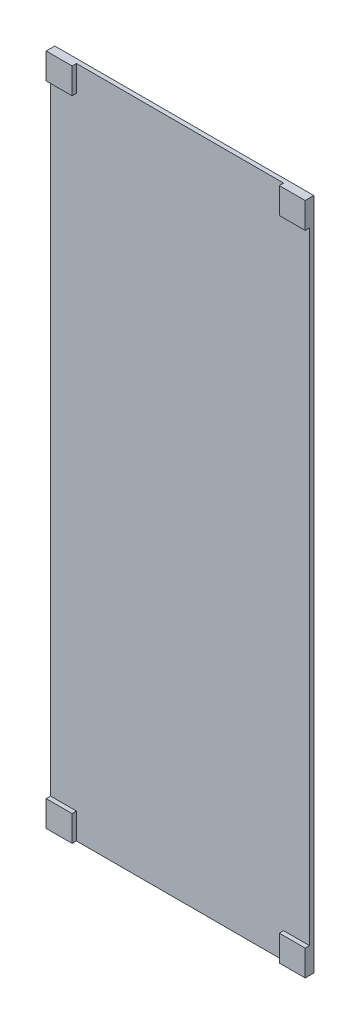
ISO-10303-21;
HEADER;
FILE_DESCRIPTION(('STEP AP214'),'2;1');
FILE_NAME('part.step','',(''),(''),'','','');
FILE_SCHEMA(('AUTOMOTIVE_DESIGN { 1 0 10303 214 1 1 1 1 }'));
ENDSEC;
DATA;
#1=APPLICATION_CONTEXT('core data for automotive mechanical design processes');
#2=APPLICATION_PROTOCOL_DEFINITION('international standard','automotive_design',2000,#1);
#3=PRODUCT_CONTEXT('',#1,'mechanical');
#4=PRODUCT('Part','Part','',(#3));
#5=PRODUCT_RELATED_PRODUCT_CATEGORY('part','',(#4));
#6=PRODUCT_DEFINITION_FORMATION('','',#4);
#7=PRODUCT_DEFINITION_CONTEXT('part definition',#1,'design');
#8=PRODUCT_DEFINITION('design','',#6,#7);
#9=PRODUCT_DEFINITION_SHAPE('','',#8);
#10=(LENGTH_UNIT() NAMED_UNIT(*) SI_UNIT(.MILLI.,.METRE.));
#11=(NAMED_UNIT(*) PLANE_ANGLE_UNIT() SI_UNIT($,.RADIAN.));
#12=(NAMED_UNIT(*) SI_UNIT($,.STERADIAN.) SOLID_ANGLE_UNIT());
#13=UNCERTAINTY_MEASURE_WITH_UNIT(LENGTH_MEASURE(1.E-05),#10,'distance_accuracy_value','');
#14=(GEOMETRIC_REPRESENTATION_CONTEXT(3) GLOBAL_UNCERTAINTY_ASSIGNED_CONTEXT((#13)) GLOBAL_UNIT_ASSIGNED_CONTEXT((#10,
#11,#12)) REPRESENTATION_CONTEXT('',''));
#15=CARTESIAN_POINT('',(0.,0.,0.));
#16=DIRECTION('',(0.,0.,1.));
#17=DIRECTION('',(1.,0.,0.));
#18=AXIS2_PLACEMENT_3D('',#15,#16,#17);
#19=CARTESIAN_POINT('',(0.,0.,25.4));
#20=DIRECTION('',(0.,0.,-1.));
#21=DIRECTION('',(-1.,0.,0.));
#22=AXIS2_PLACEMENT_3D('',#19,#20,#21);
#23=PLANE('',#22);
#24=DIRECTION('',(0.,1.,0.));
#25=VECTOR('',#24,1.);
#26=CARTESIAN_POINT('',(152.4,0.,25.4));
#27=LINE('',#26,#25);
#28=CARTESIAN_POINT('',(152.4,0.,25.4));
#29=VERTEX_POINT('',#28);
#30=CARTESIAN_POINT('',(152.4,152.4,25.4));
#31=VERTEX_POINT('',#30);
#32=EDGE_CURVE('E177',#29,#31,#27,.T.);
#33=ORIENTED_EDGE('',*,*,#32,.F.);
#34=DIRECTION('',(1.,0.,0.));
#35=VECTOR('',#34,1.);
#36=CARTESIAN_POINT('',(0.,0.,25.4));
#37=LINE('',#36,#35);
#38=CARTESIAN_POINT('',(1371.6,0.,25.4));
#39=VERTEX_POINT('',#38);
#40=EDGE_CURVE('E298',#29,#39,#37,.T.);
#41=ORIENTED_EDGE('',*,*,#40,.T.);
#42=DIRECTION('',(0.,-1.,0.));
#43=VECTOR('',#42,1.);
#44=CARTESIAN_POINT('',(1371.6,0.,25.4));
#45=LINE('',#44,#43);
#46=CARTESIAN_POINT('',(1371.6,152.4,25.4));
#47=VERTEX_POINT('',#46);
#48=EDGE_CURVE('E201',#47,#39,#45,.T.);
#49=ORIENTED_EDGE('',*,*,#48,.F.);
#50=DIRECTION('',(-1.,0.,0.));
#51=VECTOR('',#50,1.);
#52=CARTESIAN_POINT('',(1524.,152.4,25.4));
#53=LINE('',#52,#51);
#54=CARTESIAN_POINT('',(1524.,152.4,25.4));
#55=VERTEX_POINT('',#54);
#56=EDGE_CURVE('E195',#55,#47,#53,.T.);
#57=ORIENTED_EDGE('',*,*,#56,.F.);
#58=DIRECTION('',(0.,1.,0.));
#59=VECTOR('',#58,1.);
#60=CARTESIAN_POINT('',(1524.,0.,25.4));
#61=LINE('',#60,#59);
#62=CARTESIAN_POINT('',(1524.,3810.,25.4));
#63=VERTEX_POINT('',#62);
#64=EDGE_CURVE('E302',#55,#63,#61,.T.);
#65=ORIENTED_EDGE('',*,*,#64,.T.);
#66=DIRECTION('',(1.,0.,0.));
#67=VECTOR('',#66,1.);
#68=CARTESIAN_POINT('',(1524.,3810.,25.4));
#69=LINE('',#68,#67);
#70=CARTESIAN_POINT('',(1371.6,3810.,25.4));
#71=VERTEX_POINT('',#70);
#72=EDGE_CURVE('E235',#71,#63,#69,.T.);
#73=ORIENTED_EDGE('',*,*,#72,.F.);
#74=DIRECTION('',(0.,-1.,0.));
#75=VECTOR('',#74,1.);
#76=CARTESIAN_POINT('',(1371.6,3962.4,25.4));
#77=LINE('',#76,#75);
#78=CARTESIAN_POINT('',(1371.6,3962.4,25.4));
#79=VERTEX_POINT('',#78);
#80=EDGE_CURVE('E229',#79,#71,#77,.T.);
#81=ORIENTED_EDGE('',*,*,#80,.F.);
#82=DIRECTION('',(-1.,0.,0.));
#83=VECTOR('',#82,1.);
#84=CARTESIAN_POINT('',(0.,3962.4,25.4));
#85=LINE('',#84,#83);
#86=CARTESIAN_POINT('',(152.4,3962.4,25.4));
#87=VERTEX_POINT('',#86);
#88=EDGE_CURVE('E305',#79,#87,#85,.T.);
#89=ORIENTED_EDGE('',*,*,#88,.T.);
#90=DIRECTION('',(0.,1.,0.));
#91=VECTOR('',#90,1.);
#92=CARTESIAN_POINT('',(152.4,3962.4,25.4));
#93=LINE('',#92,#91);
#94=CARTESIAN_POINT('',(152.4,3810.,25.4));
#95=VERTEX_POINT('',#94);
#96=EDGE_CURVE('E268',#95,#87,#93,.T.);
#97=ORIENTED_EDGE('',*,*,#96,.F.);
#98=DIRECTION('',(1.,0.,0.));
#99=VECTOR('',#98,1.);
#100=CARTESIAN_POINT('',(0.,3810.,25.4));
#101=LINE('',#100,#99);
#102=CARTESIAN_POINT('',(0.,3810.,25.4));
#103=VERTEX_POINT('',#102);
#104=EDGE_CURVE('E262',#103,#95,#101,.T.);
#105=ORIENTED_EDGE('',*,*,#104,.F.);
#106=DIRECTION('',(0.,-1.,0.));
#107=VECTOR('',#106,1.);
#108=CARTESIAN_POINT('',(0.,0.,25.4));
#109=LINE('',#108,#107);
#110=CARTESIAN_POINT('',(0.,152.4,25.4));
#111=VERTEX_POINT('',#110);
#112=EDGE_CURVE('E60',#103,#111,#109,.T.);
#113=ORIENTED_EDGE('',*,*,#112,.T.);
#114=DIRECTION('',(-1.,0.,0.));
#115=VECTOR('',#114,1.);
#116=CARTESIAN_POINT('',(0.,152.4,25.4));
#117=LINE('',#116,#115);
#118=EDGE_CURVE('E55',#31,#111,#117,.T.);
#119=ORIENTED_EDGE('',*,*,#118,.F.);
#120=EDGE_LOOP('',(#33,#41,#49,#57,#65,#73,#81,#89,#97,#105,#113,#119));
#121=FACE_BOUND('',#120,.T.);
#122=ADVANCED_FACE('F39',(#121),#23,.F.);
#123=CARTESIAN_POINT('',(0.,0.,25.4));
#124=DIRECTION('',(1.,0.,0.));
#125=DIRECTION('',(0.,0.,-1.));
#126=AXIS2_PLACEMENT_3D('',#123,#124,#125);
#127=PLANE('',#126);
#128=DIRECTION('',(0.,-1.,0.));
#129=VECTOR('',#128,1.);
#130=CARTESIAN_POINT('',(0.,0.,0.));
#131=LINE('',#130,#129);
#132=CARTESIAN_POINT('',(0.,3962.4,0.));
#133=VERTEX_POINT('',#132);
#134=CARTESIAN_POINT('',(0.,0.,0.));
#135=VERTEX_POINT('',#134);
#136=EDGE_CURVE('E158',#133,#135,#131,.T.);
#137=ORIENTED_EDGE('',*,*,#136,.T.);
#138=DIRECTION('',(0.,0.,-1.));
#139=VECTOR('',#138,1.);
#140=CARTESIAN_POINT('',(0.,0.,25.4));
#141=LINE('',#140,#139);
#142=CARTESIAN_POINT('',(0.,0.,50.8));
#143=VERTEX_POINT('',#142);
#144=EDGE_CURVE('E11',#143,#135,#141,.T.);
#145=ORIENTED_EDGE('',*,*,#144,.F.);
#146=DIRECTION('',(0.,-1.,0.));
#147=VECTOR('',#146,1.);
#148=CARTESIAN_POINT('',(0.,0.,50.8));
#149=LINE('',#148,#147);
#150=CARTESIAN_POINT('',(0.,152.4,50.8));
#151=VERTEX_POINT('',#150);
#152=EDGE_CURVE('E155',#151,#143,#149,.T.);
#153=ORIENTED_EDGE('',*,*,#152,.F.);
#154=DIRECTION('',(0.,0.,-1.));
#155=VECTOR('',#154,1.);
#156=CARTESIAN_POINT('',(0.,152.4,50.8));
#157=LINE('',#156,#155);
#158=EDGE_CURVE('E184',#151,#111,#157,.T.);
#159=ORIENTED_EDGE('',*,*,#158,.T.);
#160=ORIENTED_EDGE('',*,*,#112,.F.);
#161=DIRECTION('',(0.,0.,-1.));
#162=VECTOR('',#161,1.);
#163=CARTESIAN_POINT('',(0.,3810.,50.8));
#164=LINE('',#163,#162);
#165=CARTESIAN_POINT('',(0.,3810.,50.8));
#166=VERTEX_POINT('',#165);
#167=EDGE_CURVE('E292',#166,#103,#164,.T.);
#168=ORIENTED_EDGE('',*,*,#167,.F.);
#169=DIRECTION('',(0.,-1.,0.));
#170=VECTOR('',#169,1.);
#171=CARTESIAN_POINT('',(0.,3962.4,50.8));
#172=LINE('',#171,#170);
#173=CARTESIAN_POINT('',(0.,3962.4,50.8));
#174=VERTEX_POINT('',#173);
#175=EDGE_CURVE('E263',#174,#166,#172,.T.);
#176=ORIENTED_EDGE('',*,*,#175,.F.);
#177=DIRECTION('',(0.,0.,-1.));
#178=VECTOR('',#177,1.);
#179=CARTESIAN_POINT('',(0.,3962.4,25.4));
#180=LINE('',#179,#178);
#181=EDGE_CURVE('E308',#174,#133,#180,.T.);
#182=ORIENTED_EDGE('',*,*,#181,.T.);
#183=EDGE_LOOP('',(#137,#145,#153,#159,#160,#168,#176,#182));
#184=FACE_BOUND('',#183,.T.);
#185=ADVANCED_FACE('F41',(#184),#127,.F.);
#186=CARTESIAN_POINT('',(0.,0.,25.4));
#187=DIRECTION('',(0.,1.,0.));
#188=DIRECTION('',(0.,0.,1.));
#189=AXIS2_PLACEMENT_3D('',#186,#187,#188);
#190=PLANE('',#189);
#191=DIRECTION('',(1.,0.,0.));
#192=VECTOR('',#191,1.);
#193=CARTESIAN_POINT('',(0.,0.,0.));
#194=LINE('',#193,#192);
#195=CARTESIAN_POINT('',(1524.,0.,0.));
#196=VERTEX_POINT('',#195);
#197=EDGE_CURVE('E311',#135,#196,#194,.T.);
#198=ORIENTED_EDGE('',*,*,#197,.T.);
#199=DIRECTION('',(0.,0.,-1.));
#200=VECTOR('',#199,1.);
#201=CARTESIAN_POINT('',(1524.,0.,25.4));
#202=LINE('',#201,#200);
#203=CARTESIAN_POINT('',(1524.,0.,50.8));
#204=VERTEX_POINT('',#203);
#205=EDGE_CURVE('E48',#204,#196,#202,.T.);
#206=ORIENTED_EDGE('',*,*,#205,.F.);
#207=DIRECTION('',(1.,0.,0.));
#208=VECTOR('',#207,1.);
#209=CARTESIAN_POINT('',(1524.,0.,50.8));
#210=LINE('',#209,#208);
#211=CARTESIAN_POINT('',(1371.6,0.,50.8));
#212=VERTEX_POINT('',#211);
#213=EDGE_CURVE('E207',#212,#204,#210,.T.);
#214=ORIENTED_EDGE('',*,*,#213,.F.);
#215=DIRECTION('',(0.,0.,-1.));
#216=VECTOR('',#215,1.);
#217=CARTESIAN_POINT('',(1371.6,0.,50.8));
#218=LINE('',#217,#216);
#219=EDGE_CURVE('E211',#212,#39,#218,.T.);
#220=ORIENTED_EDGE('',*,*,#219,.T.);
#221=ORIENTED_EDGE('',*,*,#40,.F.);
#222=DIRECTION('',(0.,0.,-1.));
#223=VECTOR('',#222,1.);
#224=CARTESIAN_POINT('',(152.4,0.,50.8));
#225=LINE('',#224,#223);
#226=CARTESIAN_POINT('',(152.4,0.,50.8));
#227=VERTEX_POINT('',#226);
#228=EDGE_CURVE('E164',#227,#29,#225,.T.);
#229=ORIENTED_EDGE('',*,*,#228,.F.);
#230=DIRECTION('',(1.,0.,0.));
#231=VECTOR('',#230,1.);
#232=CARTESIAN_POINT('',(0.,0.,50.8));
#233=LINE('',#232,#231);
#234=EDGE_CURVE('E161',#143,#227,#233,.T.);
#235=ORIENTED_EDGE('',*,*,#234,.F.);
#236=ORIENTED_EDGE('',*,*,#144,.T.);
#237=EDGE_LOOP('',(#198,#206,#214,#220,#221,#229,#235,#236));
#238=FACE_BOUND('',#237,.T.);
#239=ADVANCED_FACE('F162',(#238),#190,.F.);
#240=CARTESIAN_POINT('',(1524.,0.,25.4));
#241=DIRECTION('',(-1.,0.,0.));
#242=DIRECTION('',(0.,0.,1.));
#243=AXIS2_PLACEMENT_3D('',#240,#241,#242);
#244=PLANE('',#243);
#245=DIRECTION('',(0.,1.,0.));
#246=VECTOR('',#245,1.);
#247=CARTESIAN_POINT('',(1524.,0.,0.));
#248=LINE('',#247,#246);
#249=CARTESIAN_POINT('',(1524.,3962.4,0.));
#250=VERTEX_POINT('',#249);
#251=EDGE_CURVE('E314',#196,#250,#248,.T.);
#252=ORIENTED_EDGE('',*,*,#251,.T.);
#253=DIRECTION('',(0.,0.,-1.));
#254=VECTOR('',#253,1.);
#255=CARTESIAN_POINT('',(1524.,3962.4,25.4));
#256=LINE('',#255,#254);
#257=CARTESIAN_POINT('',(1524.,3962.4,50.8));
#258=VERTEX_POINT('',#257);
#259=EDGE_CURVE('E321',#258,#250,#256,.T.);
#260=ORIENTED_EDGE('',*,*,#259,.F.);
#261=DIRECTION('',(0.,1.,0.));
#262=VECTOR('',#261,1.);
#263=CARTESIAN_POINT('',(1524.,3962.4,50.8));
#264=LINE('',#263,#262);
#265=CARTESIAN_POINT('',(1524.,3810.,50.8));
#266=VERTEX_POINT('',#265);
#267=EDGE_CURVE('E230',#266,#258,#264,.T.);
#268=ORIENTED_EDGE('',*,*,#267,.F.);
#269=DIRECTION('',(0.,0.,-1.));
#270=VECTOR('',#269,1.);
#271=CARTESIAN_POINT('',(1524.,3810.,50.8));
#272=LINE('',#271,#270);
#273=EDGE_CURVE('E244',#266,#63,#272,.T.);
#274=ORIENTED_EDGE('',*,*,#273,.T.);
#275=ORIENTED_EDGE('',*,*,#64,.F.);
#276=DIRECTION('',(0.,0.,-1.));
#277=VECTOR('',#276,1.);
#278=CARTESIAN_POINT('',(1524.,152.4,50.8));
#279=LINE('',#278,#277);
#280=CARTESIAN_POINT('',(1524.,152.4,50.8));
#281=VERTEX_POINT('',#280);
#282=EDGE_CURVE('E225',#281,#55,#279,.T.);
#283=ORIENTED_EDGE('',*,*,#282,.F.);
#284=DIRECTION('',(0.,1.,0.));
#285=VECTOR('',#284,1.);
#286=CARTESIAN_POINT('',(1524.,0.,50.8));
#287=LINE('',#286,#285);
#288=EDGE_CURVE('E196',#204,#281,#287,.T.);
#289=ORIENTED_EDGE('',*,*,#288,.F.);
#290=ORIENTED_EDGE('',*,*,#205,.T.);
#291=EDGE_LOOP('',(#252,#260,#268,#274,#275,#283,#289,#290));
#292=FACE_BOUND('',#291,.T.);
#293=ADVANCED_FACE('F329',(#292),#244,.F.);
#294=CARTESIAN_POINT('',(0.,3962.4,25.4));
#295=DIRECTION('',(0.,-1.,0.));
#296=DIRECTION('',(0.,0.,-1.));
#297=AXIS2_PLACEMENT_3D('',#294,#295,#296);
#298=PLANE('',#297);
#299=DIRECTION('',(-1.,0.,0.));
#300=VECTOR('',#299,1.);
#301=CARTESIAN_POINT('',(0.,3962.4,0.));
#302=LINE('',#301,#300);
#303=EDGE_CURVE('E299',#250,#133,#302,.T.);
#304=ORIENTED_EDGE('',*,*,#303,.T.);
#305=ORIENTED_EDGE('',*,*,#181,.F.);
#306=DIRECTION('',(-1.,0.,0.));
#307=VECTOR('',#306,1.);
#308=CARTESIAN_POINT('',(0.,3962.4,50.8));
#309=LINE('',#308,#307);
#310=CARTESIAN_POINT('',(152.4,3962.4,50.8));
#311=VERTEX_POINT('',#310);
#312=EDGE_CURVE('E274',#311,#174,#309,.T.);
#313=ORIENTED_EDGE('',*,*,#312,.F.);
#314=DIRECTION('',(0.,0.,-1.));
#315=VECTOR('',#314,1.);
#316=CARTESIAN_POINT('',(152.4,3962.4,50.8));
#317=LINE('',#316,#315);
#318=EDGE_CURVE('E278',#311,#87,#317,.T.);
#319=ORIENTED_EDGE('',*,*,#318,.T.);
#320=ORIENTED_EDGE('',*,*,#88,.F.);
#321=DIRECTION('',(0.,0.,-1.));
#322=VECTOR('',#321,1.);
#323=CARTESIAN_POINT('',(1371.6,3962.4,50.8));
#324=LINE('',#323,#322);
#325=CARTESIAN_POINT('',(1371.6,3962.4,50.8));
#326=VERTEX_POINT('',#325);
#327=EDGE_CURVE('E258',#326,#79,#324,.T.);
#328=ORIENTED_EDGE('',*,*,#327,.F.);
#329=DIRECTION('',(-1.,0.,0.));
#330=VECTOR('',#329,1.);
#331=CARTESIAN_POINT('',(1524.,3962.4,50.8));
#332=LINE('',#331,#330);
#333=EDGE_CURVE('E234',#258,#326,#332,.T.);
#334=ORIENTED_EDGE('',*,*,#333,.F.);
#335=ORIENTED_EDGE('',*,*,#259,.T.);
#336=EDGE_LOOP('',(#304,#305,#313,#319,#320,#328,#334,#335));
#337=FACE_BOUND('',#336,.T.);
#338=ADVANCED_FACE('F336',(#337),#298,.F.);
#339=CARTESIAN_POINT('',(0.,0.,0.));
#340=DIRECTION('',(0.,0.,-1.));
#341=DIRECTION('',(-1.,0.,0.));
#342=AXIS2_PLACEMENT_3D('',#339,#340,#341);
#343=PLANE('',#342);
#344=ORIENTED_EDGE('',*,*,#136,.F.);
#345=ORIENTED_EDGE('',*,*,#303,.F.);
#346=ORIENTED_EDGE('',*,*,#251,.F.);
#347=ORIENTED_EDGE('',*,*,#197,.F.);
#348=EDGE_LOOP('',(#344,#345,#346,#347));
#349=FACE_BOUND('',#348,.T.);
#350=ADVANCED_FACE('F334',(#349),#343,.T.);
#351=CARTESIAN_POINT('',(0.,3810.,50.8));
#352=DIRECTION('',(0.,1.,0.));
#353=DIRECTION('',(0.,0.,1.));
#354=AXIS2_PLACEMENT_3D('',#351,#352,#353);
#355=PLANE('',#354);
#356=ORIENTED_EDGE('',*,*,#104,.T.);
#357=DIRECTION('',(0.,0.,-1.));
#358=VECTOR('',#357,1.);
#359=CARTESIAN_POINT('',(152.4,3810.,50.8));
#360=LINE('',#359,#358);
#361=CARTESIAN_POINT('',(152.4,3810.,50.8));
#362=VERTEX_POINT('',#361);
#363=EDGE_CURVE('E288',#362,#95,#360,.T.);
#364=ORIENTED_EDGE('',*,*,#363,.F.);
#365=DIRECTION('',(1.,0.,0.));
#366=VECTOR('',#365,1.);
#367=CARTESIAN_POINT('',(0.,3810.,50.8));
#368=LINE('',#367,#366);
#369=EDGE_CURVE('E267',#166,#362,#368,.T.);
#370=ORIENTED_EDGE('',*,*,#369,.F.);
#371=ORIENTED_EDGE('',*,*,#167,.T.);
#372=EDGE_LOOP('',(#356,#364,#370,#371));
#373=FACE_BOUND('',#372,.T.);
#374=ADVANCED_FACE('F351',(#373),#355,.F.);
#375=CARTESIAN_POINT('',(152.4,3962.4,50.8));
#376=DIRECTION('',(-1.,0.,0.));
#377=DIRECTION('',(0.,-1.,0.));
#378=AXIS2_PLACEMENT_3D('',#375,#376,#377);
#379=PLANE('',#378);
#380=ORIENTED_EDGE('',*,*,#96,.T.);
#381=ORIENTED_EDGE('',*,*,#318,.F.);
#382=DIRECTION('',(0.,1.,0.));
#383=VECTOR('',#382,1.);
#384=CARTESIAN_POINT('',(152.4,3962.4,50.8));
#385=LINE('',#384,#383);
#386=EDGE_CURVE('E271',#362,#311,#385,.T.);
#387=ORIENTED_EDGE('',*,*,#386,.F.);
#388=ORIENTED_EDGE('',*,*,#363,.T.);
#389=EDGE_LOOP('',(#380,#381,#387,#388));
#390=FACE_BOUND('',#389,.T.);
#391=ADVANCED_FACE('F349',(#390),#379,.F.);
#392=CARTESIAN_POINT('',(0.,0.,50.8));
#393=DIRECTION('',(0.,0.,1.));
#394=DIRECTION('',(1.,0.,0.));
#395=AXIS2_PLACEMENT_3D('',#392,#393,#394);
#396=PLANE('',#395);
#397=ORIENTED_EDGE('',*,*,#175,.T.);
#398=ORIENTED_EDGE('',*,*,#369,.T.);
#399=ORIENTED_EDGE('',*,*,#386,.T.);
#400=ORIENTED_EDGE('',*,*,#312,.T.);
#401=EDGE_LOOP('',(#397,#398,#399,#400));
#402=FACE_BOUND('',#401,.T.);
#403=ADVANCED_FACE('F342',(#402),#396,.T.);
#404=CARTESIAN_POINT('',(1371.6,3962.4,50.8));
#405=DIRECTION('',(1.,0.,0.));
#406=DIRECTION('',(0.,0.,-1.));
#407=AXIS2_PLACEMENT_3D('',#404,#405,#406);
#408=PLANE('',#407);
#409=ORIENTED_EDGE('',*,*,#80,.T.);
#410=DIRECTION('',(0.,0.,-1.));
#411=VECTOR('',#410,1.);
#412=CARTESIAN_POINT('',(1371.6,3810.,50.8));
#413=LINE('',#412,#411);
#414=CARTESIAN_POINT('',(1371.6,3810.,50.8));
#415=VERTEX_POINT('',#414);
#416=EDGE_CURVE('E254',#415,#71,#413,.T.);
#417=ORIENTED_EDGE('',*,*,#416,.F.);
#418=DIRECTION('',(0.,-1.,0.));
#419=VECTOR('',#418,1.);
#420=CARTESIAN_POINT('',(1371.6,3962.4,50.8));
#421=LINE('',#420,#419);
#422=EDGE_CURVE('E238',#326,#415,#421,.T.);
#423=ORIENTED_EDGE('',*,*,#422,.F.);
#424=ORIENTED_EDGE('',*,*,#327,.T.);
#425=EDGE_LOOP('',(#409,#417,#423,#424));
#426=FACE_BOUND('',#425,.T.);
#427=ADVANCED_FACE('F441',(#426),#408,.F.);
#428=CARTESIAN_POINT('',(1524.,3810.,50.8));
#429=DIRECTION('',(0.,1.,0.));
#430=DIRECTION('',(0.,0.,1.));
#431=AXIS2_PLACEMENT_3D('',#428,#429,#430);
#432=PLANE('',#431);
#433=ORIENTED_EDGE('',*,*,#72,.T.);
#434=ORIENTED_EDGE('',*,*,#273,.F.);
#435=DIRECTION('',(1.,0.,0.));
#436=VECTOR('',#435,1.);
#437=CARTESIAN_POINT('',(1524.,3810.,50.8));
#438=LINE('',#437,#436);
#439=EDGE_CURVE('E241',#415,#266,#438,.T.);
#440=ORIENTED_EDGE('',*,*,#439,.F.);
#441=ORIENTED_EDGE('',*,*,#416,.T.);
#442=EDGE_LOOP('',(#433,#434,#440,#441));
#443=FACE_BOUND('',#442,.T.);
#444=ADVANCED_FACE('F449',(#443),#432,.F.);
#445=CARTESIAN_POINT('',(0.,0.,50.8));
#446=DIRECTION('',(0.,0.,-1.));
#447=DIRECTION('',(-1.,0.,0.));
#448=AXIS2_PLACEMENT_3D('',#445,#446,#447);
#449=PLANE('',#448);
#450=ORIENTED_EDGE('',*,*,#267,.T.);
#451=ORIENTED_EDGE('',*,*,#333,.T.);
#452=ORIENTED_EDGE('',*,*,#422,.T.);
#453=ORIENTED_EDGE('',*,*,#439,.T.);
#454=EDGE_LOOP('',(#450,#451,#452,#453));
#455=FACE_BOUND('',#454,.T.);
#456=ADVANCED_FACE('F458',(#455),#449,.F.);
#457=CARTESIAN_POINT('',(1524.,152.4,50.8));
#458=DIRECTION('',(0.,-1.,0.));
#459=DIRECTION('',(0.,0.,-1.));
#460=AXIS2_PLACEMENT_3D('',#457,#458,#459);
#461=PLANE('',#460);
#462=ORIENTED_EDGE('',*,*,#56,.T.);
#463=DIRECTION('',(0.,0.,-1.));
#464=VECTOR('',#463,1.);
#465=CARTESIAN_POINT('',(1371.6,152.4,50.8));
#466=LINE('',#465,#464);
#467=CARTESIAN_POINT('',(1371.6,152.4,50.8));
#468=VERTEX_POINT('',#467);
#469=EDGE_CURVE('E221',#468,#47,#466,.T.);
#470=ORIENTED_EDGE('',*,*,#469,.F.);
#471=DIRECTION('',(-1.,0.,0.));
#472=VECTOR('',#471,1.);
#473=CARTESIAN_POINT('',(1524.,152.4,50.8));
#474=LINE('',#473,#472);
#475=EDGE_CURVE('E200',#281,#468,#474,.T.);
#476=ORIENTED_EDGE('',*,*,#475,.F.);
#477=ORIENTED_EDGE('',*,*,#282,.T.);
#478=EDGE_LOOP('',(#462,#470,#476,#477));
#479=FACE_BOUND('',#478,.T.);
#480=ADVANCED_FACE('F467',(#479),#461,.F.);
#481=CARTESIAN_POINT('',(1371.6,0.,50.8));
#482=DIRECTION('',(1.,0.,0.));
#483=DIRECTION('',(0.,0.,-1.));
#484=AXIS2_PLACEMENT_3D('',#481,#482,#483);
#485=PLANE('',#484);
#486=ORIENTED_EDGE('',*,*,#48,.T.);
#487=ORIENTED_EDGE('',*,*,#219,.F.);
#488=DIRECTION('',(0.,-1.,0.));
#489=VECTOR('',#488,1.);
#490=CARTESIAN_POINT('',(1371.6,0.,50.8));
#491=LINE('',#490,#489);
#492=EDGE_CURVE('E204',#468,#212,#491,.T.);
#493=ORIENTED_EDGE('',*,*,#492,.F.);
#494=ORIENTED_EDGE('',*,*,#469,.T.);
#495=EDGE_LOOP('',(#486,#487,#493,#494));
#496=FACE_BOUND('',#495,.T.);
#497=ADVANCED_FACE('F476',(#496),#485,.F.);
#498=CARTESIAN_POINT('',(0.,0.,50.8));
#499=DIRECTION('',(0.,0.,1.));
#500=DIRECTION('',(1.,0.,0.));
#501=AXIS2_PLACEMENT_3D('',#498,#499,#500);
#502=PLANE('',#501);
#503=ORIENTED_EDGE('',*,*,#288,.T.);
#504=ORIENTED_EDGE('',*,*,#475,.T.);
#505=ORIENTED_EDGE('',*,*,#492,.T.);
#506=ORIENTED_EDGE('',*,*,#213,.T.);
#507=EDGE_LOOP('',(#503,#504,#505,#506));
#508=FACE_BOUND('',#507,.T.);
#509=ADVANCED_FACE('F485',(#508),#502,.T.);
#510=CARTESIAN_POINT('',(152.4,0.,50.8));
#511=DIRECTION('',(-1.,0.,0.));
#512=DIRECTION('',(0.,-1.,0.));
#513=AXIS2_PLACEMENT_3D('',#510,#511,#512);
#514=PLANE('',#513);
#515=ORIENTED_EDGE('',*,*,#32,.T.);
#516=DIRECTION('',(0.,0.,-1.));
#517=VECTOR('',#516,1.);
#518=CARTESIAN_POINT('',(152.4,152.4,50.8));
#519=LINE('',#518,#517);
#520=CARTESIAN_POINT('',(152.4,152.4,50.8));
#521=VERTEX_POINT('',#520);
#522=EDGE_CURVE('E189',#521,#31,#519,.T.);
#523=ORIENTED_EDGE('',*,*,#522,.F.);
#524=DIRECTION('',(0.,1.,0.));
#525=VECTOR('',#524,1.);
#526=CARTESIAN_POINT('',(152.4,0.,50.8));
#527=LINE('',#526,#525);
#528=EDGE_CURVE('E168',#227,#521,#527,.T.);
#529=ORIENTED_EDGE('',*,*,#528,.F.);
#530=ORIENTED_EDGE('',*,*,#228,.T.);
#531=EDGE_LOOP('',(#515,#523,#529,#530));
#532=FACE_BOUND('',#531,.T.);
#533=ADVANCED_FACE('F494',(#532),#514,.F.);
#534=CARTESIAN_POINT('',(0.,152.4,50.8));
#535=DIRECTION('',(0.,-1.,0.));
#536=DIRECTION('',(0.,0.,-1.));
#537=AXIS2_PLACEMENT_3D('',#534,#535,#536);
#538=PLANE('',#537);
#539=ORIENTED_EDGE('',*,*,#118,.T.);
#540=ORIENTED_EDGE('',*,*,#158,.F.);
#541=DIRECTION('',(-1.,0.,0.));
#542=VECTOR('',#541,1.);
#543=CARTESIAN_POINT('',(0.,152.4,50.8));
#544=LINE('',#543,#542);
#545=EDGE_CURVE('E172',#521,#151,#544,.T.);
#546=ORIENTED_EDGE('',*,*,#545,.F.);
#547=ORIENTED_EDGE('',*,*,#522,.T.);
#548=EDGE_LOOP('',(#539,#540,#546,#547));
#549=FACE_BOUND('',#548,.T.);
#550=ADVANCED_FACE('F503',(#549),#538,.F.);
#551=CARTESIAN_POINT('',(0.,0.,50.8));
#552=DIRECTION('',(0.,0.,-1.));
#553=DIRECTION('',(-1.,0.,0.));
#554=AXIS2_PLACEMENT_3D('',#551,#552,#553);
#555=PLANE('',#554);
#556=ORIENTED_EDGE('',*,*,#152,.T.);
#557=ORIENTED_EDGE('',*,*,#234,.T.);
#558=ORIENTED_EDGE('',*,*,#528,.T.);
#559=ORIENTED_EDGE('',*,*,#545,.T.);
#560=EDGE_LOOP('',(#556,#557,#558,#559));
#561=FACE_BOUND('',#560,.T.);
#562=ADVANCED_FACE('F170',(#561),#555,.F.);
#563=CLOSED_SHELL('',(#122,#185,#239,#293,#338,#350,#374,#391,#403,#427,#444,#456,#480,#497,
#509,#533,#550,#562));
#564=MANIFOLD_SOLID_BREP('B2',#563);
#565=ADVANCED_BREP_SHAPE_REPRESENTATION('',(#18,#564),#14);
#566=SHAPE_DEFINITION_REPRESENTATION(#9,#565);
ENDSEC;
END-ISO-10303-21;
